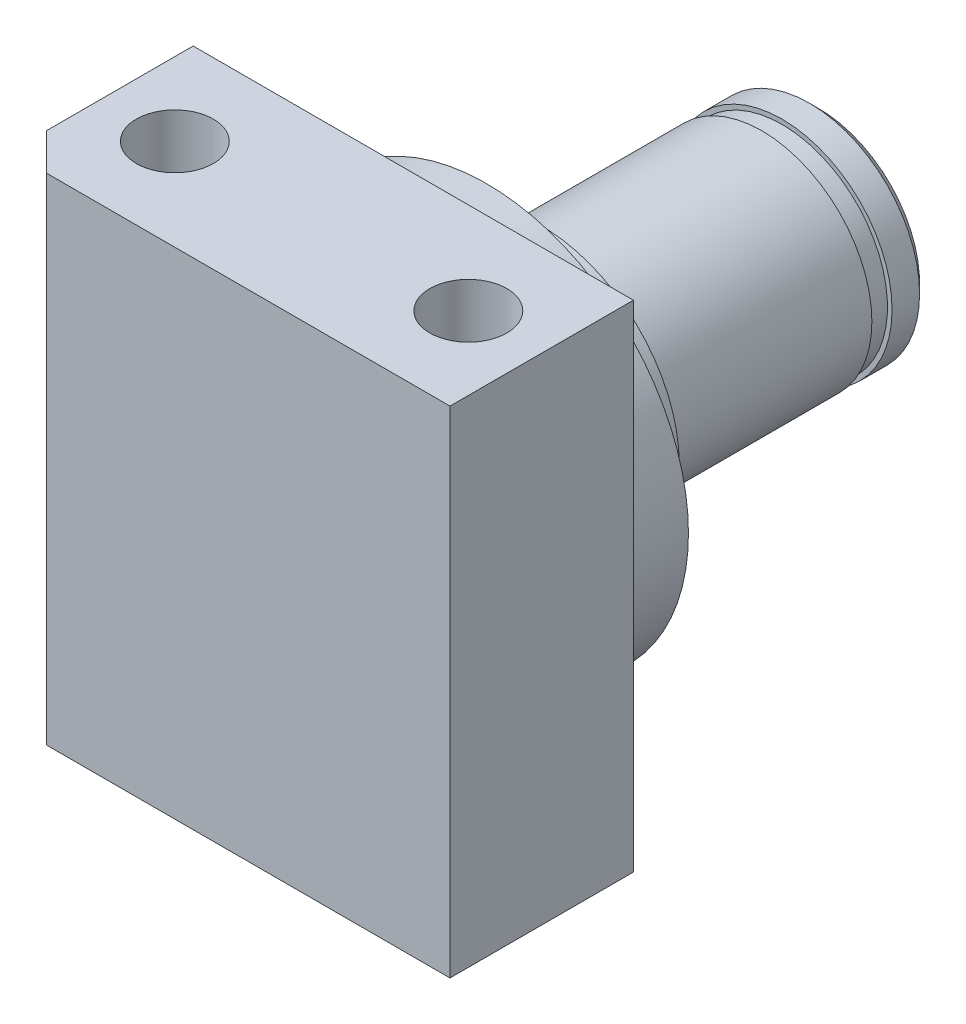
ISO-10303-21;
HEADER;
FILE_DESCRIPTION(('STEP AP214'),'2;1');
FILE_NAME('part.step','',(''),(''),'','','');
FILE_SCHEMA(('AUTOMOTIVE_DESIGN { 1 0 10303 214 1 1 1 1 }'));
ENDSEC;
DATA;
#1=APPLICATION_CONTEXT('core data for automotive mechanical design processes');
#2=APPLICATION_PROTOCOL_DEFINITION('international standard','automotive_design',2000,#1);
#3=PRODUCT_CONTEXT('',#1,'mechanical');
#4=PRODUCT('Part','Part','',(#3));
#5=PRODUCT_RELATED_PRODUCT_CATEGORY('part','',(#4));
#6=PRODUCT_DEFINITION_FORMATION('','',#4);
#7=PRODUCT_DEFINITION_CONTEXT('part definition',#1,'design');
#8=PRODUCT_DEFINITION('design','',#6,#7);
#9=PRODUCT_DEFINITION_SHAPE('','',#8);
#10=(LENGTH_UNIT() NAMED_UNIT(*) SI_UNIT(.MILLI.,.METRE.));
#11=(NAMED_UNIT(*) PLANE_ANGLE_UNIT() SI_UNIT($,.RADIAN.));
#12=(NAMED_UNIT(*) SI_UNIT($,.STERADIAN.) SOLID_ANGLE_UNIT());
#13=UNCERTAINTY_MEASURE_WITH_UNIT(LENGTH_MEASURE(1.E-05),#10,'distance_accuracy_value','');
#14=(GEOMETRIC_REPRESENTATION_CONTEXT(3) GLOBAL_UNCERTAINTY_ASSIGNED_CONTEXT((#13)) GLOBAL_UNIT_ASSIGNED_CONTEXT((#10,
#11,#12)) REPRESENTATION_CONTEXT('',''));
#15=CARTESIAN_POINT('',(0.,0.,0.));
#16=DIRECTION('',(0.,0.,1.));
#17=DIRECTION('',(1.,0.,0.));
#18=AXIS2_PLACEMENT_3D('',#15,#16,#17);
#19=CARTESIAN_POINT('',(12.,13.5,10.));
#20=DIRECTION('',(-1.,0.,0.));
#21=DIRECTION('',(0.,-1.,0.));
#22=AXIS2_PLACEMENT_3D('',#19,#20,#21);
#23=PLANE('',#22);
#24=DIRECTION('',(0.,1.,0.));
#25=VECTOR('',#24,1.);
#26=CARTESIAN_POINT('',(12.,13.5,0.));
#27=LINE('',#26,#25);
#28=CARTESIAN_POINT('',(12.,-13.5,0.));
#29=VERTEX_POINT('',#28);
#30=CARTESIAN_POINT('',(12.,13.5,0.));
#31=VERTEX_POINT('',#30);
#32=EDGE_CURVE('E101',#29,#31,#27,.T.);
#33=ORIENTED_EDGE('',*,*,#32,.T.);
#34=DIRECTION('',(0.,0.,-1.));
#35=VECTOR('',#34,1.);
#36=CARTESIAN_POINT('',(12.,13.5,10.));
#37=LINE('',#36,#35);
#38=CARTESIAN_POINT('',(12.,13.5,10.));
#39=VERTEX_POINT('',#38);
#40=EDGE_CURVE('E84',#39,#31,#37,.T.);
#41=ORIENTED_EDGE('',*,*,#40,.F.);
#42=DIRECTION('',(0.,1.,0.));
#43=VECTOR('',#42,1.);
#44=CARTESIAN_POINT('',(12.,13.5,10.));
#45=LINE('',#44,#43);
#46=CARTESIAN_POINT('',(12.,-13.5,10.));
#47=VERTEX_POINT('',#46);
#48=EDGE_CURVE('E91',#47,#39,#45,.T.);
#49=ORIENTED_EDGE('',*,*,#48,.F.);
#50=DIRECTION('',(0.,0.,-1.));
#51=VECTOR('',#50,1.);
#52=CARTESIAN_POINT('',(12.,-13.5,10.));
#53=LINE('',#52,#51);
#54=EDGE_CURVE('E129',#47,#29,#53,.T.);
#55=ORIENTED_EDGE('',*,*,#54,.T.);
#56=EDGE_LOOP('',(#33,#41,#49,#55));
#57=FACE_BOUND('',#56,.T.);
#58=ADVANCED_FACE('F34',(#57),#23,.F.);
#59=CARTESIAN_POINT('',(-12.,13.5,10.));
#60=DIRECTION('',(0.,-1.,0.));
#61=DIRECTION('',(0.,0.,-1.));
#62=AXIS2_PLACEMENT_3D('',#59,#60,#61);
#63=PLANE('',#62);
#64=CARTESIAN_POINT('',(8.,13.5,5.));
#65=DIRECTION('',(0.,1.,0.));
#66=DIRECTION('',(0.,0.,1.));
#67=AXIS2_PLACEMENT_3D('',#64,#65,#66);
#68=CIRCLE('',#67,2.1);
#69=CARTESIAN_POINT('',(8.,13.5,7.1));
#70=VERTEX_POINT('',#69);
#71=EDGE_CURVE('E118',#70,#70,#68,.T.);
#72=ORIENTED_EDGE('',*,*,#71,.F.);
#73=EDGE_LOOP('',(#72));
#74=FACE_BOUND('',#73,.T.);
#75=CARTESIAN_POINT('',(-8.,13.5,5.));
#76=DIRECTION('',(0.,1.,0.));
#77=DIRECTION('',(0.,0.,1.));
#78=AXIS2_PLACEMENT_3D('',#75,#76,#77);
#79=CIRCLE('',#78,2.1);
#80=CARTESIAN_POINT('',(-8.,13.5,7.1));
#81=VERTEX_POINT('',#80);
#82=EDGE_CURVE('E115',#81,#81,#79,.T.);
#83=ORIENTED_EDGE('',*,*,#82,.F.);
#84=EDGE_LOOP('',(#83));
#85=FACE_BOUND('',#84,.T.);
#86=DIRECTION('',(0.,0.,-1.));
#87=VECTOR('',#86,1.);
#88=CARTESIAN_POINT('',(-12.,13.5,10.));
#89=LINE('',#88,#87);
#90=CARTESIAN_POINT('',(-12.,13.5,7.99999999999999));
#91=VERTEX_POINT('',#90);
#92=CARTESIAN_POINT('',(-12.,13.5,0.));
#93=VERTEX_POINT('',#92);
#94=EDGE_CURVE('E103',#91,#93,#89,.T.);
#95=ORIENTED_EDGE('',*,*,#94,.F.);
#96=DIRECTION('',(0.707106781186546,0.,0.707106781186549));
#97=VECTOR('',#96,1.);
#98=CARTESIAN_POINT('',(-10.,13.5,10.));
#99=LINE('',#98,#97);
#100=CARTESIAN_POINT('',(-10.,13.5,10.));
#101=VERTEX_POINT('',#100);
#102=EDGE_CURVE('E11',#91,#101,#99,.T.);
#103=ORIENTED_EDGE('',*,*,#102,.T.);
#104=DIRECTION('',(-1.,0.,0.));
#105=VECTOR('',#104,1.);
#106=CARTESIAN_POINT('',(-12.,13.5,10.));
#107=LINE('',#106,#105);
#108=EDGE_CURVE('E79',#39,#101,#107,.T.);
#109=ORIENTED_EDGE('',*,*,#108,.F.);
#110=ORIENTED_EDGE('',*,*,#40,.T.);
#111=DIRECTION('',(-1.,0.,0.));
#112=VECTOR('',#111,1.);
#113=CARTESIAN_POINT('',(-12.,13.5,0.));
#114=LINE('',#113,#112);
#115=EDGE_CURVE('E134',#31,#93,#114,.T.);
#116=ORIENTED_EDGE('',*,*,#115,.T.);
#117=EDGE_LOOP('',(#95,#103,#109,#110,#116));
#118=FACE_BOUND('',#117,.T.);
#119=ADVANCED_FACE('F81',(#74,#85,#118),#63,.F.);
#120=CARTESIAN_POINT('',(-12.,13.5,10.));
#121=DIRECTION('',(1.,0.,0.));
#122=DIRECTION('',(0.,1.,0.));
#123=AXIS2_PLACEMENT_3D('',#120,#121,#122);
#124=PLANE('',#123);
#125=DIRECTION('',(0.,0.,-1.));
#126=VECTOR('',#125,1.);
#127=CARTESIAN_POINT('',(-12.,-13.5,10.));
#128=LINE('',#127,#126);
#129=CARTESIAN_POINT('',(-12.,-13.5,7.99999999999999));
#130=VERTEX_POINT('',#129);
#131=CARTESIAN_POINT('',(-12.,-13.5,0.));
#132=VERTEX_POINT('',#131);
#133=EDGE_CURVE('E108',#130,#132,#128,.T.);
#134=ORIENTED_EDGE('',*,*,#133,.F.);
#135=DIRECTION('',(0.,1.,0.));
#136=VECTOR('',#135,1.);
#137=CARTESIAN_POINT('',(-12.,13.5,7.99999999999999));
#138=LINE('',#137,#136);
#139=EDGE_CURVE('E42',#130,#91,#138,.T.);
#140=ORIENTED_EDGE('',*,*,#139,.T.);
#141=ORIENTED_EDGE('',*,*,#94,.T.);
#142=DIRECTION('',(0.,-1.,0.));
#143=VECTOR('',#142,1.);
#144=CARTESIAN_POINT('',(-12.,13.5,0.));
#145=LINE('',#144,#143);
#146=EDGE_CURVE('E136',#93,#132,#145,.T.);
#147=ORIENTED_EDGE('',*,*,#146,.T.);
#148=EDGE_LOOP('',(#134,#140,#141,#147));
#149=FACE_BOUND('',#148,.T.);
#150=ADVANCED_FACE('F141',(#149),#124,.F.);
#151=CARTESIAN_POINT('',(-12.,-13.5,10.));
#152=DIRECTION('',(0.,1.,0.));
#153=DIRECTION('',(0.,0.,1.));
#154=AXIS2_PLACEMENT_3D('',#151,#152,#153);
#155=PLANE('',#154);
#156=CARTESIAN_POINT('',(8.,-13.5,5.));
#157=DIRECTION('',(0.,1.,0.));
#158=DIRECTION('',(0.,0.,1.));
#159=AXIS2_PLACEMENT_3D('',#156,#157,#158);
#160=CIRCLE('',#159,2.1);
#161=CARTESIAN_POINT('',(8.,-13.5,7.1));
#162=VERTEX_POINT('',#161);
#163=EDGE_CURVE('E116',#162,#162,#160,.T.);
#164=ORIENTED_EDGE('',*,*,#163,.T.);
#165=EDGE_LOOP('',(#164));
#166=FACE_BOUND('',#165,.T.);
#167=CARTESIAN_POINT('',(-8.,-13.5,5.));
#168=DIRECTION('',(0.,1.,0.));
#169=DIRECTION('',(0.,0.,1.));
#170=AXIS2_PLACEMENT_3D('',#167,#168,#169);
#171=CIRCLE('',#170,2.1);
#172=CARTESIAN_POINT('',(-8.,-13.5,7.1));
#173=VERTEX_POINT('',#172);
#174=EDGE_CURVE('E112',#173,#173,#171,.T.);
#175=ORIENTED_EDGE('',*,*,#174,.T.);
#176=EDGE_LOOP('',(#175));
#177=FACE_BOUND('',#176,.T.);
#178=DIRECTION('',(1.,0.,0.));
#179=VECTOR('',#178,1.);
#180=CARTESIAN_POINT('',(-12.,-13.5,10.));
#181=LINE('',#180,#179);
#182=CARTESIAN_POINT('',(-9.99999999999999,-13.5,10.));
#183=VERTEX_POINT('',#182);
#184=EDGE_CURVE('E90',#183,#47,#181,.T.);
#185=ORIENTED_EDGE('',*,*,#184,.F.);
#186=DIRECTION('',(-0.707106781186546,0.,-0.707106781186549));
#187=VECTOR('',#186,1.);
#188=CARTESIAN_POINT('',(-9.99999999999999,-13.5,10.));
#189=LINE('',#188,#187);
#190=EDGE_CURVE('E56',#183,#130,#189,.T.);
#191=ORIENTED_EDGE('',*,*,#190,.T.);
#192=ORIENTED_EDGE('',*,*,#133,.T.);
#193=DIRECTION('',(1.,0.,0.));
#194=VECTOR('',#193,1.);
#195=CARTESIAN_POINT('',(-12.,-13.5,0.));
#196=LINE('',#195,#194);
#197=EDGE_CURVE('E98',#132,#29,#196,.T.);
#198=ORIENTED_EDGE('',*,*,#197,.T.);
#199=ORIENTED_EDGE('',*,*,#54,.F.);
#200=EDGE_LOOP('',(#185,#191,#192,#198,#199));
#201=FACE_BOUND('',#200,.T.);
#202=ADVANCED_FACE('F128',(#166,#177,#201),#155,.F.);
#203=CARTESIAN_POINT('',(0.,0.,10.));
#204=DIRECTION('',(0.,0.,1.));
#205=DIRECTION('',(1.,0.,0.));
#206=AXIS2_PLACEMENT_3D('',#203,#204,#205);
#207=PLANE('',#206);
#208=ORIENTED_EDGE('',*,*,#108,.T.);
#209=DIRECTION('',(0.,-1.,0.));
#210=VECTOR('',#209,1.);
#211=CARTESIAN_POINT('',(-9.99999999999999,-13.5,10.));
#212=LINE('',#211,#210);
#213=EDGE_CURVE('E125',#101,#183,#212,.T.);
#214=ORIENTED_EDGE('',*,*,#213,.T.);
#215=ORIENTED_EDGE('',*,*,#184,.T.);
#216=ORIENTED_EDGE('',*,*,#48,.T.);
#217=EDGE_LOOP('',(#208,#214,#215,#216));
#218=FACE_BOUND('',#217,.T.);
#219=ADVANCED_FACE('F94',(#218),#207,.T.);
#220=CARTESIAN_POINT('',(0.,0.,0.));
#221=DIRECTION('',(0.,0.,1.));
#222=DIRECTION('',(1.,0.,0.));
#223=AXIS2_PLACEMENT_3D('',#220,#221,#222);
#224=PLANE('',#223);
#225=CARTESIAN_POINT('',(0.,0.,0.));
#226=DIRECTION('',(0.,0.,1.));
#227=DIRECTION('',(1.,0.,0.));
#228=AXIS2_PLACEMENT_3D('',#225,#226,#227);
#229=CIRCLE('',#228,11.);
#230=CARTESIAN_POINT('',(11.,0.,0.));
#231=VERTEX_POINT('',#230);
#232=EDGE_CURVE('E382',#231,#231,#229,.T.);
#233=ORIENTED_EDGE('',*,*,#232,.T.);
#234=EDGE_LOOP('',(#233));
#235=FACE_BOUND('',#234,.T.);
#236=ORIENTED_EDGE('',*,*,#32,.F.);
#237=ORIENTED_EDGE('',*,*,#197,.F.);
#238=ORIENTED_EDGE('',*,*,#146,.F.);
#239=ORIENTED_EDGE('',*,*,#115,.F.);
#240=EDGE_LOOP('',(#236,#237,#238,#239));
#241=FACE_BOUND('',#240,.T.);
#242=ADVANCED_FACE('F143',(#235,#241),#224,.F.);
#243=CARTESIAN_POINT('',(-8.,-23.513519789092,5.));
#244=DIRECTION('',(0.,1.,0.));
#245=DIRECTION('',(0.,0.,1.));
#246=AXIS2_PLACEMENT_3D('',#243,#244,#245);
#247=CYLINDRICAL_SURFACE('',#246,2.1);
#248=ORIENTED_EDGE('',*,*,#82,.T.);
#249=EDGE_LOOP('',(#248));
#250=FACE_BOUND('',#249,.T.);
#251=ORIENTED_EDGE('',*,*,#174,.F.);
#252=EDGE_LOOP('',(#251));
#253=FACE_BOUND('',#252,.T.);
#254=ADVANCED_FACE('F166',(#250,#253),#247,.F.);
#255=CARTESIAN_POINT('',(8.,-23.513519789092,5.));
#256=DIRECTION('',(0.,1.,0.));
#257=DIRECTION('',(0.,0.,1.));
#258=AXIS2_PLACEMENT_3D('',#255,#256,#257);
#259=CYLINDRICAL_SURFACE('',#258,2.1);
#260=ORIENTED_EDGE('',*,*,#71,.T.);
#261=EDGE_LOOP('',(#260));
#262=FACE_BOUND('',#261,.T.);
#263=ORIENTED_EDGE('',*,*,#163,.F.);
#264=EDGE_LOOP('',(#263));
#265=FACE_BOUND('',#264,.T.);
#266=ADVANCED_FACE('F172',(#262,#265),#259,.F.);
#267=CARTESIAN_POINT('',(0.,0.,-4.));
#268=DIRECTION('',(0.,0.,1.));
#269=DIRECTION('',(1.,0.,0.));
#270=AXIS2_PLACEMENT_3D('',#267,#268,#269);
#271=CYLINDRICAL_SURFACE('',#270,11.);
#272=CARTESIAN_POINT('',(0.,0.,-4.));
#273=DIRECTION('',(0.,0.,1.));
#274=DIRECTION('',(1.,0.,0.));
#275=AXIS2_PLACEMENT_3D('',#272,#273,#274);
#276=CIRCLE('',#275,11.);
#277=CARTESIAN_POINT('',(11.,0.,-4.));
#278=VERTEX_POINT('',#277);
#279=EDGE_CURVE('E383',#278,#278,#276,.T.);
#280=ORIENTED_EDGE('',*,*,#279,.T.);
#281=EDGE_LOOP('',(#280));
#282=FACE_BOUND('',#281,.T.);
#283=ORIENTED_EDGE('',*,*,#232,.F.);
#284=EDGE_LOOP('',(#283));
#285=FACE_BOUND('',#284,.T.);
#286=ADVANCED_FACE('F176',(#282,#285),#271,.T.);
#287=CARTESIAN_POINT('',(0.,0.,-4.));
#288=DIRECTION('',(0.,0.,1.));
#289=DIRECTION('',(1.,0.,0.));
#290=AXIS2_PLACEMENT_3D('',#287,#288,#289);
#291=PLANE('',#290);
#292=CARTESIAN_POINT('',(0.,0.,-4.));
#293=DIRECTION('',(0.,0.,1.));
#294=DIRECTION('',(1.,0.,0.));
#295=AXIS2_PLACEMENT_3D('',#292,#293,#294);
#296=CIRCLE('',#295,7.5);
#297=CARTESIAN_POINT('',(7.5,0.,-4.));
#298=VERTEX_POINT('',#297);
#299=EDGE_CURVE('E102',#298,#298,#296,.F.);
#300=ORIENTED_EDGE('',*,*,#299,.F.);
#301=EDGE_LOOP('',(#300));
#302=FACE_BOUND('',#301,.T.);
#303=ORIENTED_EDGE('',*,*,#279,.F.);
#304=EDGE_LOOP('',(#303));
#305=FACE_BOUND('',#304,.T.);
#306=ADVANCED_FACE('F180',(#302,#305),#291,.F.);
#307=CARTESIAN_POINT('',(0.,0.,-7.));
#308=DIRECTION('',(0.,0.,1.));
#309=DIRECTION('',(1.,0.,0.));
#310=AXIS2_PLACEMENT_3D('',#307,#308,#309);
#311=CYLINDRICAL_SURFACE('',#310,7.5);
#312=CARTESIAN_POINT('',(0.,0.,-7.));
#313=DIRECTION('',(0.,0.,-1.));
#314=DIRECTION('',(-1.,0.,0.));
#315=AXIS2_PLACEMENT_3D('',#312,#313,#314);
#316=CIRCLE('',#315,7.5);
#317=CARTESIAN_POINT('',(-7.5,0.,-7.));
#318=VERTEX_POINT('',#317);
#319=EDGE_CURVE('E377',#318,#318,#316,.T.);
#320=ORIENTED_EDGE('',*,*,#319,.F.);
#321=EDGE_LOOP('',(#320));
#322=FACE_BOUND('',#321,.T.);
#323=ORIENTED_EDGE('',*,*,#299,.T.);
#324=EDGE_LOOP('',(#323));
#325=FACE_BOUND('',#324,.T.);
#326=ADVANCED_FACE('F184',(#322,#325),#311,.T.);
#327=CARTESIAN_POINT('',(0.,0.,-7.));
#328=DIRECTION('',(0.,0.,-1.));
#329=DIRECTION('',(-1.,0.,0.));
#330=AXIS2_PLACEMENT_3D('',#327,#328,#329);
#331=PLANE('',#330);
#332=CARTESIAN_POINT('',(0.,0.,-7.));
#333=DIRECTION('',(0.,0.,-1.));
#334=DIRECTION('',(-1.,0.,0.));
#335=AXIS2_PLACEMENT_3D('',#332,#333,#334);
#336=CIRCLE('',#335,5.75);
#337=CARTESIAN_POINT('',(-5.75,0.,-7.));
#338=VERTEX_POINT('',#337);
#339=EDGE_CURVE('E371',#338,#338,#336,.T.);
#340=ORIENTED_EDGE('',*,*,#339,.F.);
#341=EDGE_LOOP('',(#340));
#342=FACE_BOUND('',#341,.T.);
#343=ORIENTED_EDGE('',*,*,#319,.T.);
#344=EDGE_LOOP('',(#343));
#345=FACE_BOUND('',#344,.T.);
#346=ADVANCED_FACE('F188',(#342,#345),#331,.T.);
#347=CARTESIAN_POINT('',(0.,0.,-7.5));
#348=DIRECTION('',(0.,0.,1.));
#349=DIRECTION('',(1.,0.,0.));
#350=AXIS2_PLACEMENT_3D('',#347,#348,#349);
#351=CYLINDRICAL_SURFACE('',#350,5.75);
#352=CARTESIAN_POINT('',(0.,0.,-7.5));
#353=DIRECTION('',(0.,0.,-1.));
#354=DIRECTION('',(-1.,0.,0.));
#355=AXIS2_PLACEMENT_3D('',#352,#353,#354);
#356=CIRCLE('',#355,5.75);
#357=CARTESIAN_POINT('',(-5.75,0.,-7.5));
#358=VERTEX_POINT('',#357);
#359=EDGE_CURVE('E374',#358,#358,#356,.T.);
#360=ORIENTED_EDGE('',*,*,#359,.F.);
#361=EDGE_LOOP('',(#360));
#362=FACE_BOUND('',#361,.T.);
#363=ORIENTED_EDGE('',*,*,#339,.T.);
#364=EDGE_LOOP('',(#363));
#365=FACE_BOUND('',#364,.T.);
#366=ADVANCED_FACE('F192',(#362,#365),#351,.T.);
#367=CARTESIAN_POINT('',(0.,0.,-19.));
#368=DIRECTION('',(0.,0.,1.));
#369=DIRECTION('',(1.,0.,0.));
#370=AXIS2_PLACEMENT_3D('',#367,#368,#369);
#371=CYLINDRICAL_SURFACE('',#370,6.);
#372=CARTESIAN_POINT('',(0.,0.,-19.));
#373=DIRECTION('',(0.,0.,-1.));
#374=DIRECTION('',(-1.,0.,0.));
#375=AXIS2_PLACEMENT_3D('',#372,#373,#374);
#376=CIRCLE('',#375,6.);
#377=CARTESIAN_POINT('',(-6.,0.,-19.));
#378=VERTEX_POINT('',#377);
#379=EDGE_CURVE('E368',#378,#378,#376,.T.);
#380=ORIENTED_EDGE('',*,*,#379,.F.);
#381=EDGE_LOOP('',(#380));
#382=FACE_BOUND('',#381,.T.);
#383=CARTESIAN_POINT('',(0.,0.,-7.5));
#384=DIRECTION('',(0.,0.,-1.));
#385=DIRECTION('',(-1.,0.,0.));
#386=AXIS2_PLACEMENT_3D('',#383,#384,#385);
#387=CIRCLE('',#386,6.);
#388=CARTESIAN_POINT('',(-6.,0.,-7.5));
#389=VERTEX_POINT('',#388);
#390=EDGE_CURVE('E366',#389,#389,#387,.T.);
#391=ORIENTED_EDGE('',*,*,#390,.T.);
#392=EDGE_LOOP('',(#391));
#393=FACE_BOUND('',#392,.T.);
#394=ADVANCED_FACE('F196',(#382,#393),#371,.T.);
#395=CARTESIAN_POINT('',(0.,0.,-19.));
#396=DIRECTION('',(0.,0.,-1.));
#397=DIRECTION('',(-1.,0.,0.));
#398=AXIS2_PLACEMENT_3D('',#395,#396,#397);
#399=PLANE('',#398);
#400=CARTESIAN_POINT('',(0.,0.,-19.));
#401=DIRECTION('',(0.,0.,-1.));
#402=DIRECTION('',(-1.,0.,0.));
#403=AXIS2_PLACEMENT_3D('',#400,#401,#402);
#404=CIRCLE('',#403,5.75);
#405=CARTESIAN_POINT('',(-5.75,0.,-19.));
#406=VERTEX_POINT('',#405);
#407=EDGE_CURVE('E361',#406,#406,#404,.T.);
#408=ORIENTED_EDGE('',*,*,#407,.F.);
#409=EDGE_LOOP('',(#408));
#410=FACE_BOUND('',#409,.T.);
#411=ORIENTED_EDGE('',*,*,#379,.T.);
#412=EDGE_LOOP('',(#411));
#413=FACE_BOUND('',#412,.T.);
#414=ADVANCED_FACE('F200',(#410,#413),#399,.T.);
#415=CARTESIAN_POINT('',(0.,0.,-7.5));
#416=DIRECTION('',(0.,0.,-1.));
#417=DIRECTION('',(-1.,0.,0.));
#418=AXIS2_PLACEMENT_3D('',#415,#416,#417);
#419=PLANE('',#418);
#420=ORIENTED_EDGE('',*,*,#359,.T.);
#421=EDGE_LOOP('',(#420));
#422=FACE_BOUND('',#421,.T.);
#423=ORIENTED_EDGE('',*,*,#390,.F.);
#424=EDGE_LOOP('',(#423));
#425=FACE_BOUND('',#424,.T.);
#426=ADVANCED_FACE('F202',(#422,#425),#419,.F.);
#427=CARTESIAN_POINT('',(0.,0.,-20.1));
#428=DIRECTION('',(0.,0.,1.));
#429=DIRECTION('',(1.,0.,0.));
#430=AXIS2_PLACEMENT_3D('',#427,#428,#429);
#431=CYLINDRICAL_SURFACE('',#430,5.75);
#432=CARTESIAN_POINT('',(0.,0.,-20.1));
#433=DIRECTION('',(0.,0.,-1.));
#434=DIRECTION('',(-1.,0.,0.));
#435=AXIS2_PLACEMENT_3D('',#432,#433,#434);
#436=CIRCLE('',#435,5.75);
#437=CARTESIAN_POINT('',(-5.75,0.,-20.1));
#438=VERTEX_POINT('',#437);
#439=EDGE_CURVE('E356',#438,#438,#436,.T.);
#440=ORIENTED_EDGE('',*,*,#439,.F.);
#441=EDGE_LOOP('',(#440));
#442=FACE_BOUND('',#441,.T.);
#443=ORIENTED_EDGE('',*,*,#407,.T.);
#444=EDGE_LOOP('',(#443));
#445=FACE_BOUND('',#444,.T.);
#446=ADVANCED_FACE('F205',(#442,#445),#431,.T.);
#447=CARTESIAN_POINT('',(0.,0.,-22.1));
#448=DIRECTION('',(0.,0.,1.));
#449=DIRECTION('',(1.,0.,0.));
#450=AXIS2_PLACEMENT_3D('',#447,#448,#449);
#451=CYLINDRICAL_SURFACE('',#450,6.);
#452=CARTESIAN_POINT('',(0.,0.,-21.6));
#453=DIRECTION('',(0.,0.,-1.));
#454=DIRECTION('',(-1.,0.,0.));
#455=AXIS2_PLACEMENT_3D('',#452,#453,#454);
#456=CIRCLE('',#455,6.);
#457=CARTESIAN_POINT('',(-6.,0.,-21.6));
#458=VERTEX_POINT('',#457);
#459=EDGE_CURVE('E122',#458,#458,#456,.F.);
#460=ORIENTED_EDGE('',*,*,#459,.T.);
#461=EDGE_LOOP('',(#460));
#462=FACE_BOUND('',#461,.T.);
#463=CARTESIAN_POINT('',(0.,0.,-20.1));
#464=DIRECTION('',(0.,0.,-1.));
#465=DIRECTION('',(-1.,0.,0.));
#466=AXIS2_PLACEMENT_3D('',#463,#464,#465);
#467=CIRCLE('',#466,6.);
#468=CARTESIAN_POINT('',(-6.,0.,-20.1));
#469=VERTEX_POINT('',#468);
#470=EDGE_CURVE('E359',#469,#469,#467,.T.);
#471=ORIENTED_EDGE('',*,*,#470,.T.);
#472=EDGE_LOOP('',(#471));
#473=FACE_BOUND('',#472,.T.);
#474=ADVANCED_FACE('F212',(#462,#473),#451,.T.);
#475=CARTESIAN_POINT('',(0.,0.,-22.1));
#476=DIRECTION('',(0.,0.,-1.));
#477=DIRECTION('',(-1.,0.,0.));
#478=AXIS2_PLACEMENT_3D('',#475,#476,#477);
#479=PLANE('',#478);
#480=CARTESIAN_POINT('',(0.,0.,-22.1));
#481=DIRECTION('',(0.,0.,-1.));
#482=DIRECTION('',(-1.,0.,0.));
#483=AXIS2_PLACEMENT_3D('',#480,#481,#482);
#484=CIRCLE('',#483,5.5);
#485=CARTESIAN_POINT('',(-5.5,0.,-22.1));
#486=VERTEX_POINT('',#485);
#487=EDGE_CURVE('E106',#486,#486,#484,.T.);
#488=ORIENTED_EDGE('',*,*,#487,.T.);
#489=EDGE_LOOP('',(#488));
#490=FACE_BOUND('',#489,.T.);
#491=ADVANCED_FACE('F216',(#490),#479,.T.);
#492=CARTESIAN_POINT('',(0.,0.,-20.1));
#493=DIRECTION('',(0.,0.,-1.));
#494=DIRECTION('',(-1.,0.,0.));
#495=AXIS2_PLACEMENT_3D('',#492,#493,#494);
#496=PLANE('',#495);
#497=ORIENTED_EDGE('',*,*,#439,.T.);
#498=EDGE_LOOP('',(#497));
#499=FACE_BOUND('',#498,.T.);
#500=ORIENTED_EDGE('',*,*,#470,.F.);
#501=EDGE_LOOP('',(#500));
#502=FACE_BOUND('',#501,.T.);
#503=ADVANCED_FACE('F149',(#499,#502),#496,.F.);
#504=CARTESIAN_POINT('',(0.,0.,-22.1));
#505=DIRECTION('',(0.,0.,1.));
#506=DIRECTION('',(1.,0.,0.));
#507=AXIS2_PLACEMENT_3D('',#504,#505,#506);
#508=CONICAL_SURFACE('',#507,5.5,0.785398163397447);
#509=ORIENTED_EDGE('',*,*,#459,.F.);
#510=EDGE_LOOP('',(#509));
#511=FACE_BOUND('',#510,.T.);
#512=ORIENTED_EDGE('',*,*,#487,.F.);
#513=EDGE_LOOP('',(#512));
#514=FACE_BOUND('',#513,.T.);
#515=ADVANCED_FACE('F145',(#511,#514),#508,.T.);
#516=CARTESIAN_POINT('',(-9.99999999999999,0.,10.));
#517=DIRECTION('',(-0.707106781186549,0.,0.707106781186546));
#518=DIRECTION('',(0.,1.,0.));
#519=AXIS2_PLACEMENT_3D('',#516,#517,#518);
#520=PLANE('',#519);
#521=ORIENTED_EDGE('',*,*,#102,.F.);
#522=ORIENTED_EDGE('',*,*,#139,.F.);
#523=ORIENTED_EDGE('',*,*,#190,.F.);
#524=ORIENTED_EDGE('',*,*,#213,.F.);
#525=EDGE_LOOP('',(#521,#522,#523,#524));
#526=FACE_BOUND('',#525,.T.);
#527=ADVANCED_FACE('F36',(#526),#520,.T.);
#528=CLOSED_SHELL('',(#58,#119,#150,#202,#219,#242,#254,#266,#286,#306,#326,#346,#366,#394,#414,
#426,#446,#474,#491,#503,#515,#527));
#529=MANIFOLD_SOLID_BREP('B2',#528);
#530=ADVANCED_BREP_SHAPE_REPRESENTATION('',(#18,#529),#14);
#531=SHAPE_DEFINITION_REPRESENTATION(#9,#530);
ENDSEC;
END-ISO-10303-21;
